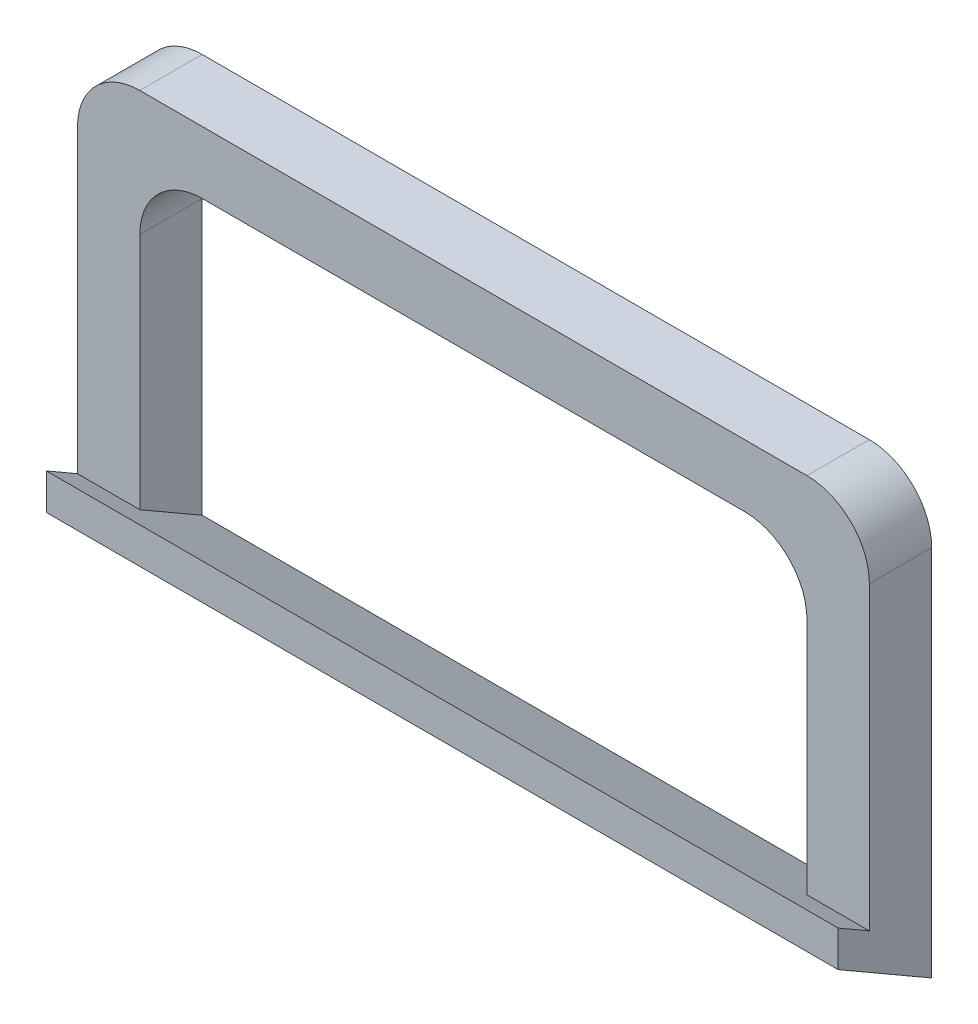
ISO-10303-21;
HEADER;
FILE_DESCRIPTION(('STEP AP214'),'2;1');
FILE_NAME('part.step','',(''),(''),'','','');
FILE_SCHEMA(('AUTOMOTIVE_DESIGN { 1 0 10303 214 1 1 1 1 }'));
ENDSEC;
DATA;
#1=APPLICATION_CONTEXT('core data for automotive mechanical design processes');
#2=APPLICATION_PROTOCOL_DEFINITION('international standard','automotive_design',2000,#1);
#3=PRODUCT_CONTEXT('',#1,'mechanical');
#4=PRODUCT('Part','Part','',(#3));
#5=PRODUCT_RELATED_PRODUCT_CATEGORY('part','',(#4));
#6=PRODUCT_DEFINITION_FORMATION('','',#4);
#7=PRODUCT_DEFINITION_CONTEXT('part definition',#1,'design');
#8=PRODUCT_DEFINITION('design','',#6,#7);
#9=PRODUCT_DEFINITION_SHAPE('','',#8);
#10=(LENGTH_UNIT() NAMED_UNIT(*) SI_UNIT(.MILLI.,.METRE.));
#11=(NAMED_UNIT(*) PLANE_ANGLE_UNIT() SI_UNIT($,.RADIAN.));
#12=(NAMED_UNIT(*) SI_UNIT($,.STERADIAN.) SOLID_ANGLE_UNIT());
#13=UNCERTAINTY_MEASURE_WITH_UNIT(LENGTH_MEASURE(1.E-05),#10,'distance_accuracy_value','');
#14=(GEOMETRIC_REPRESENTATION_CONTEXT(3) GLOBAL_UNCERTAINTY_ASSIGNED_CONTEXT((#13)) GLOBAL_UNIT_ASSIGNED_CONTEXT((#10,
#11,#12)) REPRESENTATION_CONTEXT('',''));
#15=CARTESIAN_POINT('',(0.,0.,0.));
#16=DIRECTION('',(0.,0.,1.));
#17=DIRECTION('',(1.,0.,0.));
#18=AXIS2_PLACEMENT_3D('',#15,#16,#17);
#19=CARTESIAN_POINT('',(-26.9311619996836,-5.2517006802721,10.));
#20=DIRECTION('',(-1.,0.,0.));
#21=DIRECTION('',(0.,0.,1.));
#22=AXIS2_PLACEMENT_3D('',#19,#20,#21);
#23=PLANE('',#22);
#24=DIRECTION('',(0.,1.,0.));
#25=VECTOR('',#24,1.);
#26=CARTESIAN_POINT('',(-26.9311619996836,-5.2517006802721,10.));
#27=LINE('',#26,#25);
#28=CARTESIAN_POINT('',(-26.9311619996836,0.521802011624217,10.));
#29=VERTEX_POINT('',#28);
#30=CARTESIAN_POINT('',(-26.9311619996836,38.7482993197278,10.));
#31=VERTEX_POINT('',#30);
#32=EDGE_CURVE('E212',#29,#31,#27,.T.);
#33=ORIENTED_EDGE('',*,*,#32,.F.);
#34=DIRECTION('',(0.,-0.500000000000004,-0.866025403784436));
#35=VECTOR('',#34,1.);
#36=CARTESIAN_POINT('',(-26.9311619996836,-0.921573661349882,7.49999999999996));
#37=LINE('',#36,#35);
#38=CARTESIAN_POINT('',(-26.9311619996836,-5.2517006802721,0.));
#39=VERTEX_POINT('',#38);
#40=EDGE_CURVE('E207',#29,#39,#37,.T.);
#41=ORIENTED_EDGE('',*,*,#40,.T.);
#42=DIRECTION('',(0.,1.,0.));
#43=VECTOR('',#42,1.);
#44=CARTESIAN_POINT('',(-26.9311619996836,-5.2517006802721,0.));
#45=LINE('',#44,#43);
#46=CARTESIAN_POINT('',(-26.9311619996836,38.7482993197278,0.));
#47=VERTEX_POINT('',#46);
#48=EDGE_CURVE('E211',#39,#47,#45,.T.);
#49=ORIENTED_EDGE('',*,*,#48,.T.);
#50=DIRECTION('',(0.,0.,-1.));
#51=VECTOR('',#50,1.);
#52=CARTESIAN_POINT('',(-26.9311619996836,38.7482993197278,10.));
#53=LINE('',#52,#51);
#54=EDGE_CURVE('E11',#31,#47,#53,.T.);
#55=ORIENTED_EDGE('',*,*,#54,.F.);
#56=EDGE_LOOP('',(#33,#41,#49,#55));
#57=FACE_BOUND('',#56,.T.);
#58=ADVANCED_FACE('F43',(#57),#23,.F.);
#59=CARTESIAN_POINT('',(-16.9311619996836,38.7482993197279,10.));
#60=DIRECTION('',(0.,0.,-1.));
#61=DIRECTION('',(-1.,0.,0.));
#62=AXIS2_PLACEMENT_3D('',#59,#60,#61);
#63=CYLINDRICAL_SURFACE('',#62,10.);
#64=CARTESIAN_POINT('',(-16.9311619996836,38.7482993197279,0.));
#65=DIRECTION('',(0.,0.,-1.));
#66=DIRECTION('',(-1.,0.,0.));
#67=AXIS2_PLACEMENT_3D('',#64,#65,#66);
#68=CIRCLE('',#67,10.);
#69=CARTESIAN_POINT('',(-16.9311619996835,48.7482993197279,0.));
#70=VERTEX_POINT('',#69);
#71=EDGE_CURVE('E245',#47,#70,#68,.T.);
#72=ORIENTED_EDGE('',*,*,#71,.T.);
#73=DIRECTION('',(0.,0.,-1.));
#74=VECTOR('',#73,1.);
#75=CARTESIAN_POINT('',(-16.9311619996835,48.7482993197279,10.));
#76=LINE('',#75,#74);
#77=CARTESIAN_POINT('',(-16.9311619996835,48.7482993197279,10.));
#78=VERTEX_POINT('',#77);
#79=EDGE_CURVE('E51',#78,#70,#76,.T.);
#80=ORIENTED_EDGE('',*,*,#79,.F.);
#81=CARTESIAN_POINT('',(-16.9311619996836,38.7482993197279,10.));
#82=DIRECTION('',(0.,0.,-1.));
#83=DIRECTION('',(-1.,0.,0.));
#84=AXIS2_PLACEMENT_3D('',#81,#82,#83);
#85=CIRCLE('',#84,10.);
#86=EDGE_CURVE('E215',#31,#78,#85,.T.);
#87=ORIENTED_EDGE('',*,*,#86,.F.);
#88=ORIENTED_EDGE('',*,*,#54,.T.);
#89=EDGE_LOOP('',(#72,#80,#87,#88));
#90=FACE_BOUND('',#89,.T.);
#91=ADVANCED_FACE('F335',(#90),#63,.F.);
#92=CARTESIAN_POINT('',(-16.9311619996835,48.7482993197279,10.));
#93=DIRECTION('',(0.,1.,0.));
#94=DIRECTION('',(-1.,0.,0.));
#95=AXIS2_PLACEMENT_3D('',#92,#93,#94);
#96=PLANE('',#95);
#97=DIRECTION('',(1.,0.,0.));
#98=VECTOR('',#97,1.);
#99=CARTESIAN_POINT('',(-16.9311619996835,48.7482993197279,0.));
#100=LINE('',#99,#98);
#101=CARTESIAN_POINT('',(70.0688380003163,48.7482993197278,0.));
#102=VERTEX_POINT('',#101);
#103=EDGE_CURVE('E248',#70,#102,#100,.T.);
#104=ORIENTED_EDGE('',*,*,#103,.T.);
#105=DIRECTION('',(0.,0.,-1.));
#106=VECTOR('',#105,1.);
#107=CARTESIAN_POINT('',(70.0688380003163,48.7482993197278,10.));
#108=LINE('',#107,#106);
#109=CARTESIAN_POINT('',(70.0688380003163,48.7482993197278,10.));
#110=VERTEX_POINT('',#109);
#111=EDGE_CURVE('E284',#110,#102,#108,.T.);
#112=ORIENTED_EDGE('',*,*,#111,.F.);
#113=DIRECTION('',(1.,0.,0.));
#114=VECTOR('',#113,1.);
#115=CARTESIAN_POINT('',(-16.9311619996835,48.7482993197279,10.));
#116=LINE('',#115,#114);
#117=EDGE_CURVE('E219',#78,#110,#116,.T.);
#118=ORIENTED_EDGE('',*,*,#117,.F.);
#119=ORIENTED_EDGE('',*,*,#79,.T.);
#120=EDGE_LOOP('',(#104,#112,#118,#119));
#121=FACE_BOUND('',#120,.T.);
#122=ADVANCED_FACE('F293',(#121),#96,.F.);
#123=CARTESIAN_POINT('',(70.0688380003163,38.7482993197278,10.));
#124=DIRECTION('',(0.,0.,-1.));
#125=DIRECTION('',(-1.,0.,0.));
#126=AXIS2_PLACEMENT_3D('',#123,#124,#125);
#127=CYLINDRICAL_SURFACE('',#126,10.);
#128=CARTESIAN_POINT('',(70.0688380003163,38.7482993197278,0.));
#129=DIRECTION('',(0.,0.,-1.));
#130=DIRECTION('',(-1.,0.,0.));
#131=AXIS2_PLACEMENT_3D('',#128,#129,#130);
#132=CIRCLE('',#131,10.);
#133=CARTESIAN_POINT('',(80.0688380003163,38.7482993197278,0.));
#134=VERTEX_POINT('',#133);
#135=EDGE_CURVE('E251',#102,#134,#132,.T.);
#136=ORIENTED_EDGE('',*,*,#135,.T.);
#137=DIRECTION('',(0.,0.,-1.));
#138=VECTOR('',#137,1.);
#139=CARTESIAN_POINT('',(80.0688380003163,38.7482993197278,10.));
#140=LINE('',#139,#138);
#141=CARTESIAN_POINT('',(80.0688380003163,38.7482993197278,10.));
#142=VERTEX_POINT('',#141);
#143=EDGE_CURVE('E280',#142,#134,#140,.T.);
#144=ORIENTED_EDGE('',*,*,#143,.F.);
#145=CARTESIAN_POINT('',(70.0688380003163,38.7482993197278,10.));
#146=DIRECTION('',(0.,0.,-1.));
#147=DIRECTION('',(-1.,0.,0.));
#148=AXIS2_PLACEMENT_3D('',#145,#146,#147);
#149=CIRCLE('',#148,10.);
#150=EDGE_CURVE('E222',#110,#142,#149,.T.);
#151=ORIENTED_EDGE('',*,*,#150,.F.);
#152=ORIENTED_EDGE('',*,*,#111,.T.);
#153=EDGE_LOOP('',(#136,#144,#151,#152));
#154=FACE_BOUND('',#153,.T.);
#155=ADVANCED_FACE('F304',(#154),#127,.F.);
#156=CARTESIAN_POINT('',(80.0688380003163,38.7482993197278,10.));
#157=DIRECTION('',(1.,0.,0.));
#158=DIRECTION('',(0.,0.,-1.));
#159=AXIS2_PLACEMENT_3D('',#156,#157,#158);
#160=PLANE('',#159);
#161=DIRECTION('',(0.,-1.,0.));
#162=VECTOR('',#161,1.);
#163=CARTESIAN_POINT('',(80.0688380003163,38.7482993197278,0.));
#164=LINE('',#163,#162);
#165=CARTESIAN_POINT('',(80.0688380003163,-5.25170068027218,0.));
#166=VERTEX_POINT('',#165);
#167=EDGE_CURVE('E157',#134,#166,#164,.T.);
#168=ORIENTED_EDGE('',*,*,#167,.T.);
#169=DIRECTION('',(0.,0.500000000000004,0.866025403784436));
#170=VECTOR('',#169,1.);
#171=CARTESIAN_POINT('',(80.0688380003163,10.0784263386503,26.5525588832577));
#172=LINE('',#171,#170);
#173=CARTESIAN_POINT('',(80.0688380003163,0.521802011624217,10.));
#174=VERTEX_POINT('',#173);
#175=EDGE_CURVE('E203',#166,#174,#172,.T.);
#176=ORIENTED_EDGE('',*,*,#175,.T.);
#177=DIRECTION('',(0.,-1.,0.));
#178=VECTOR('',#177,1.);
#179=CARTESIAN_POINT('',(80.0688380003163,38.7482993197278,10.));
#180=LINE('',#179,#178);
#181=EDGE_CURVE('E225',#142,#174,#180,.T.);
#182=ORIENTED_EDGE('',*,*,#181,.F.);
#183=ORIENTED_EDGE('',*,*,#143,.T.);
#184=EDGE_LOOP('',(#168,#176,#182,#183));
#185=FACE_BOUND('',#184,.T.);
#186=ADVANCED_FACE('F308',(#185),#160,.F.);
#187=CARTESIAN_POINT('',(90.0688380003164,48.7482993197278,10.));
#188=DIRECTION('',(-1.,0.,0.));
#189=DIRECTION('',(0.,0.,1.));
#190=AXIS2_PLACEMENT_3D('',#187,#188,#189);
#191=PLANE('',#190);
#192=DIRECTION('',(0.,1.,0.));
#193=VECTOR('',#192,1.);
#194=CARTESIAN_POINT('',(90.0688380003164,48.7482993197278,10.));
#195=LINE('',#194,#193);
#196=CARTESIAN_POINT('',(90.0688380003164,0.521802011624224,10.));
#197=VERTEX_POINT('',#196);
#198=CARTESIAN_POINT('',(90.0688380003164,48.7482993197278,10.));
#199=VERTEX_POINT('',#198);
#200=EDGE_CURVE('E228',#197,#199,#195,.T.);
#201=ORIENTED_EDGE('',*,*,#200,.F.);
#202=DIRECTION('',(0.,-0.500000000000004,-0.866025403784436));
#203=VECTOR('',#202,1.);
#204=CARTESIAN_POINT('',(90.0688380003165,-5.2517006802721,0.));
#205=LINE('',#204,#203);
#206=CARTESIAN_POINT('',(90.0688380003165,3.40855335757238,15.));
#207=VERTEX_POINT('',#206);
#208=EDGE_CURVE('E167',#207,#197,#205,.T.);
#209=ORIENTED_EDGE('',*,*,#208,.F.);
#210=DIRECTION('',(0.,1.,0.));
#211=VECTOR('',#210,1.);
#212=CARTESIAN_POINT('',(90.0688380003165,3.40855335757238,15.));
#213=LINE('',#212,#211);
#214=CARTESIAN_POINT('',(90.0688380003165,-2.36494933432394,15.));
#215=VERTEX_POINT('',#214);
#216=EDGE_CURVE('E173',#215,#207,#213,.T.);
#217=ORIENTED_EDGE('',*,*,#216,.F.);
#218=DIRECTION('',(0.,0.500000000000004,0.866025403784436));
#219=VECTOR('',#218,1.);
#220=CARTESIAN_POINT('',(90.0688380003165,-11.0252033721684,0.));
#221=LINE('',#220,#219);
#222=CARTESIAN_POINT('',(90.0688380003165,-11.0252033721684,0.));
#223=VERTEX_POINT('',#222);
#224=EDGE_CURVE('E162',#223,#215,#221,.T.);
#225=ORIENTED_EDGE('',*,*,#224,.F.);
#226=DIRECTION('',(0.,1.,0.));
#227=VECTOR('',#226,1.);
#228=CARTESIAN_POINT('',(90.0688380003164,48.7482993197278,0.));
#229=LINE('',#228,#227);
#230=CARTESIAN_POINT('',(90.0688380003164,48.7482993197278,0.));
#231=VERTEX_POINT('',#230);
#232=EDGE_CURVE('E144',#223,#231,#229,.T.);
#233=ORIENTED_EDGE('',*,*,#232,.T.);
#234=DIRECTION('',(0.,0.,-1.));
#235=VECTOR('',#234,1.);
#236=CARTESIAN_POINT('',(90.0688380003164,48.7482993197278,10.));
#237=LINE('',#236,#235);
#238=EDGE_CURVE('E277',#199,#231,#237,.T.);
#239=ORIENTED_EDGE('',*,*,#238,.F.);
#240=EDGE_LOOP('',(#201,#209,#217,#225,#233,#239));
#241=FACE_BOUND('',#240,.T.);
#242=ADVANCED_FACE('F170',(#241),#191,.F.);
#243=CARTESIAN_POINT('',(80.0688380003163,48.7482993197278,10.));
#244=DIRECTION('',(0.,0.,-1.));
#245=DIRECTION('',(-1.,0.,0.));
#246=AXIS2_PLACEMENT_3D('',#243,#244,#245);
#247=CYLINDRICAL_SURFACE('',#246,10.0000000000001);
#248=CARTESIAN_POINT('',(80.0688380003163,48.7482993197278,0.));
#249=DIRECTION('',(0.,0.,1.));
#250=DIRECTION('',(-1.,0.,0.));
#251=AXIS2_PLACEMENT_3D('',#248,#249,#250);
#252=CIRCLE('',#251,10.0000000000001);
#253=CARTESIAN_POINT('',(80.0688380003163,58.7482993197279,0.));
#254=VERTEX_POINT('',#253);
#255=EDGE_CURVE('E151',#231,#254,#252,.T.);
#256=ORIENTED_EDGE('',*,*,#255,.T.);
#257=DIRECTION('',(0.,0.,-1.));
#258=VECTOR('',#257,1.);
#259=CARTESIAN_POINT('',(80.0688380003163,58.7482993197279,10.));
#260=LINE('',#259,#258);
#261=CARTESIAN_POINT('',(80.0688380003163,58.7482993197279,10.));
#262=VERTEX_POINT('',#261);
#263=EDGE_CURVE('E273',#262,#254,#260,.T.);
#264=ORIENTED_EDGE('',*,*,#263,.F.);
#265=CARTESIAN_POINT('',(80.0688380003163,48.7482993197278,10.));
#266=DIRECTION('',(0.,0.,1.));
#267=DIRECTION('',(-1.,0.,0.));
#268=AXIS2_PLACEMENT_3D('',#265,#266,#267);
#269=CIRCLE('',#268,10.0000000000001);
#270=EDGE_CURVE('E231',#199,#262,#269,.T.);
#271=ORIENTED_EDGE('',*,*,#270,.F.);
#272=ORIENTED_EDGE('',*,*,#238,.T.);
#273=EDGE_LOOP('',(#256,#264,#271,#272));
#274=FACE_BOUND('',#273,.T.);
#275=ADVANCED_FACE('F320',(#274),#247,.T.);
#276=CARTESIAN_POINT('',(-26.9311619996835,58.7482993197279,10.));
#277=DIRECTION('',(0.,-1.,0.));
#278=DIRECTION('',(1.,0.,0.));
#279=AXIS2_PLACEMENT_3D('',#276,#277,#278);
#280=PLANE('',#279);
#281=DIRECTION('',(-1.,0.,0.));
#282=VECTOR('',#281,1.);
#283=CARTESIAN_POINT('',(-26.9311619996835,58.7482993197279,0.));
#284=LINE('',#283,#282);
#285=CARTESIAN_POINT('',(-26.9311619996835,58.7482993197279,0.));
#286=VERTEX_POINT('',#285);
#287=EDGE_CURVE('E258',#254,#286,#284,.T.);
#288=ORIENTED_EDGE('',*,*,#287,.T.);
#289=DIRECTION('',(0.,0.,-1.));
#290=VECTOR('',#289,1.);
#291=CARTESIAN_POINT('',(-26.9311619996835,58.7482993197279,10.));
#292=LINE('',#291,#290);
#293=CARTESIAN_POINT('',(-26.9311619996835,58.7482993197279,10.));
#294=VERTEX_POINT('',#293);
#295=EDGE_CURVE('E269',#294,#286,#292,.T.);
#296=ORIENTED_EDGE('',*,*,#295,.F.);
#297=DIRECTION('',(-1.,0.,0.));
#298=VECTOR('',#297,1.);
#299=CARTESIAN_POINT('',(-26.9311619996835,58.7482993197279,10.));
#300=LINE('',#299,#298);
#301=EDGE_CURVE('E234',#262,#294,#300,.T.);
#302=ORIENTED_EDGE('',*,*,#301,.F.);
#303=ORIENTED_EDGE('',*,*,#263,.T.);
#304=EDGE_LOOP('',(#288,#296,#302,#303));
#305=FACE_BOUND('',#304,.T.);
#306=ADVANCED_FACE('F322',(#305),#280,.F.);
#307=CARTESIAN_POINT('',(-26.9311619996836,48.7482993197279,10.));
#308=DIRECTION('',(0.,0.,-1.));
#309=DIRECTION('',(-1.,0.,0.));
#310=AXIS2_PLACEMENT_3D('',#307,#308,#309);
#311=CYLINDRICAL_SURFACE('',#310,10.);
#312=CARTESIAN_POINT('',(-26.9311619996836,48.7482993197279,0.));
#313=DIRECTION('',(0.,0.,1.));
#314=DIRECTION('',(1.,0.,0.));
#315=AXIS2_PLACEMENT_3D('',#312,#313,#314);
#316=CIRCLE('',#315,10.);
#317=CARTESIAN_POINT('',(-36.9311619996836,48.7482993197278,0.));
#318=VERTEX_POINT('',#317);
#319=EDGE_CURVE('E261',#286,#318,#316,.T.);
#320=ORIENTED_EDGE('',*,*,#319,.T.);
#321=DIRECTION('',(0.,0.,-1.));
#322=VECTOR('',#321,1.);
#323=CARTESIAN_POINT('',(-36.9311619996836,48.7482993197278,10.));
#324=LINE('',#323,#322);
#325=CARTESIAN_POINT('',(-36.9311619996836,48.7482993197278,10.));
#326=VERTEX_POINT('',#325);
#327=EDGE_CURVE('E242',#326,#318,#324,.T.);
#328=ORIENTED_EDGE('',*,*,#327,.F.);
#329=CARTESIAN_POINT('',(-26.9311619996836,48.7482993197279,10.));
#330=DIRECTION('',(0.,0.,1.));
#331=DIRECTION('',(1.,0.,0.));
#332=AXIS2_PLACEMENT_3D('',#329,#330,#331);
#333=CIRCLE('',#332,10.);
#334=EDGE_CURVE('E237',#294,#326,#333,.T.);
#335=ORIENTED_EDGE('',*,*,#334,.F.);
#336=ORIENTED_EDGE('',*,*,#295,.T.);
#337=EDGE_LOOP('',(#320,#328,#335,#336));
#338=FACE_BOUND('',#337,.T.);
#339=ADVANCED_FACE('F327',(#338),#311,.T.);
#340=CARTESIAN_POINT('',(-36.9311619996836,-5.2517006802721,10.));
#341=DIRECTION('',(1.,0.,0.));
#342=DIRECTION('',(0.,0.,-1.));
#343=AXIS2_PLACEMENT_3D('',#340,#341,#342);
#344=PLANE('',#343);
#345=DIRECTION('',(0.,-1.,0.));
#346=VECTOR('',#345,1.);
#347=CARTESIAN_POINT('',(-36.9311619996836,-5.2517006802721,0.));
#348=LINE('',#347,#346);
#349=CARTESIAN_POINT('',(-36.9311619996836,-11.0252033721684,0.));
#350=VERTEX_POINT('',#349);
#351=EDGE_CURVE('E216',#318,#350,#348,.T.);
#352=ORIENTED_EDGE('',*,*,#351,.T.);
#353=DIRECTION('',(0.,0.500000000000004,0.866025403784436));
#354=VECTOR('',#353,1.);
#355=CARTESIAN_POINT('',(-36.9311619996836,-11.0252033721684,0.));
#356=LINE('',#355,#354);
#357=CARTESIAN_POINT('',(-36.9311619996836,-2.36494933432394,15.));
#358=VERTEX_POINT('',#357);
#359=EDGE_CURVE('E164',#350,#358,#356,.T.);
#360=ORIENTED_EDGE('',*,*,#359,.T.);
#361=DIRECTION('',(0.,1.,0.));
#362=VECTOR('',#361,1.);
#363=CARTESIAN_POINT('',(-36.9311619996836,3.40855335757238,15.));
#364=LINE('',#363,#362);
#365=CARTESIAN_POINT('',(-36.9311619996836,3.40855335757238,15.));
#366=VERTEX_POINT('',#365);
#367=EDGE_CURVE('E181',#358,#366,#364,.T.);
#368=ORIENTED_EDGE('',*,*,#367,.T.);
#369=DIRECTION('',(0.,-0.500000000000004,-0.866025403784436));
#370=VECTOR('',#369,1.);
#371=CARTESIAN_POINT('',(-36.9311619996836,-5.2517006802721,0.));
#372=LINE('',#371,#370);
#373=CARTESIAN_POINT('',(-36.9311619996836,0.521802011624223,10.));
#374=VERTEX_POINT('',#373);
#375=EDGE_CURVE('E175',#366,#374,#372,.T.);
#376=ORIENTED_EDGE('',*,*,#375,.T.);
#377=DIRECTION('',(0.,-1.,0.));
#378=VECTOR('',#377,1.);
#379=CARTESIAN_POINT('',(-36.9311619996836,-5.2517006802721,10.));
#380=LINE('',#379,#378);
#381=EDGE_CURVE('E58',#326,#374,#380,.T.);
#382=ORIENTED_EDGE('',*,*,#381,.F.);
#383=ORIENTED_EDGE('',*,*,#327,.T.);
#384=EDGE_LOOP('',(#352,#360,#368,#376,#382,#383));
#385=FACE_BOUND('',#384,.T.);
#386=ADVANCED_FACE('F329',(#385),#344,.F.);
#387=CARTESIAN_POINT('',(-16.9311619996836,38.7482993197279,10.));
#388=DIRECTION('',(0.,0.,-1.));
#389=DIRECTION('',(-1.,0.,0.));
#390=AXIS2_PLACEMENT_3D('',#387,#388,#389);
#391=PLANE('',#390);
#392=ORIENTED_EDGE('',*,*,#381,.T.);
#393=DIRECTION('',(1.,0.,0.));
#394=VECTOR('',#393,1.);
#395=CARTESIAN_POINT('',(-16.9311619996836,0.521802011624217,10.));
#396=LINE('',#395,#394);
#397=EDGE_CURVE('E204',#374,#29,#396,.T.);
#398=ORIENTED_EDGE('',*,*,#397,.T.);
#399=ORIENTED_EDGE('',*,*,#32,.T.);
#400=ORIENTED_EDGE('',*,*,#86,.T.);
#401=ORIENTED_EDGE('',*,*,#117,.T.);
#402=ORIENTED_EDGE('',*,*,#150,.T.);
#403=ORIENTED_EDGE('',*,*,#181,.T.);
#404=EDGE_CURVE('E65',#174,#197,#396,.T.);
#405=ORIENTED_EDGE('',*,*,#404,.T.);
#406=ORIENTED_EDGE('',*,*,#200,.T.);
#407=ORIENTED_EDGE('',*,*,#270,.T.);
#408=ORIENTED_EDGE('',*,*,#301,.T.);
#409=ORIENTED_EDGE('',*,*,#334,.T.);
#410=EDGE_LOOP('',(#392,#398,#399,#400,#401,#402,#403,#405,#406,#407,#408,#409));
#411=FACE_BOUND('',#410,.T.);
#412=ADVANCED_FACE('F310',(#411),#391,.F.);
#413=CARTESIAN_POINT('',(-16.9311619996836,38.7482993197279,0.));
#414=DIRECTION('',(0.,0.,-1.));
#415=DIRECTION('',(-1.,0.,0.));
#416=AXIS2_PLACEMENT_3D('',#413,#414,#415);
#417=PLANE('',#416);
#418=ORIENTED_EDGE('',*,*,#48,.F.);
#419=DIRECTION('',(-1.,0.,0.));
#420=VECTOR('',#419,1.);
#421=CARTESIAN_POINT('',(90.0688380003165,-5.2517006802721,0.));
#422=LINE('',#421,#420);
#423=EDGE_CURVE('E192',#166,#39,#422,.T.);
#424=ORIENTED_EDGE('',*,*,#423,.F.);
#425=ORIENTED_EDGE('',*,*,#167,.F.);
#426=ORIENTED_EDGE('',*,*,#135,.F.);
#427=ORIENTED_EDGE('',*,*,#103,.F.);
#428=ORIENTED_EDGE('',*,*,#71,.F.);
#429=EDGE_LOOP('',(#418,#424,#425,#426,#427,#428));
#430=FACE_BOUND('',#429,.T.);
#431=DIRECTION('',(-1.,0.,0.));
#432=VECTOR('',#431,1.);
#433=CARTESIAN_POINT('',(90.0688380003165,-11.0252033721684,0.));
#434=LINE('',#433,#432);
#435=EDGE_CURVE('E148',#223,#350,#434,.T.);
#436=ORIENTED_EDGE('',*,*,#435,.T.);
#437=ORIENTED_EDGE('',*,*,#351,.F.);
#438=ORIENTED_EDGE('',*,*,#319,.F.);
#439=ORIENTED_EDGE('',*,*,#287,.F.);
#440=ORIENTED_EDGE('',*,*,#255,.F.);
#441=ORIENTED_EDGE('',*,*,#232,.F.);
#442=EDGE_LOOP('',(#436,#437,#438,#439,#440,#441));
#443=FACE_BOUND('',#442,.T.);
#444=ADVANCED_FACE('F146',(#430,#443),#417,.T.);
#445=CARTESIAN_POINT('',(90.0688380003165,-5.2517006802721,0.));
#446=DIRECTION('',(0.,0.866025403784436,-0.500000000000004));
#447=DIRECTION('',(0.,0.500000000000004,0.866025403784436));
#448=AXIS2_PLACEMENT_3D('',#445,#446,#447);
#449=PLANE('',#448);
#450=ORIENTED_EDGE('',*,*,#40,.F.);
#451=ORIENTED_EDGE('',*,*,#397,.F.);
#452=ORIENTED_EDGE('',*,*,#375,.F.);
#453=DIRECTION('',(-1.,0.,0.));
#454=VECTOR('',#453,1.);
#455=CARTESIAN_POINT('',(90.0688380003165,3.40855335757238,15.));
#456=LINE('',#455,#454);
#457=EDGE_CURVE('E196',#207,#366,#456,.T.);
#458=ORIENTED_EDGE('',*,*,#457,.F.);
#459=ORIENTED_EDGE('',*,*,#208,.T.);
#460=ORIENTED_EDGE('',*,*,#404,.F.);
#461=ORIENTED_EDGE('',*,*,#175,.F.);
#462=ORIENTED_EDGE('',*,*,#423,.T.);
#463=EDGE_LOOP('',(#450,#451,#452,#458,#459,#460,#461,#462));
#464=FACE_BOUND('',#463,.T.);
#465=ADVANCED_FACE('F313',(#464),#449,.T.);
#466=CARTESIAN_POINT('',(90.0688380003165,3.40855335757238,15.));
#467=DIRECTION('',(0.,0.,1.));
#468=DIRECTION('',(1.,0.,0.));
#469=AXIS2_PLACEMENT_3D('',#466,#467,#468);
#470=PLANE('',#469);
#471=ORIENTED_EDGE('',*,*,#367,.F.);
#472=DIRECTION('',(-1.,0.,0.));
#473=VECTOR('',#472,1.);
#474=CARTESIAN_POINT('',(90.0688380003165,-2.36494933432394,15.));
#475=LINE('',#474,#473);
#476=EDGE_CURVE('E166',#215,#358,#475,.T.);
#477=ORIENTED_EDGE('',*,*,#476,.F.);
#478=ORIENTED_EDGE('',*,*,#216,.T.);
#479=ORIENTED_EDGE('',*,*,#457,.T.);
#480=EDGE_LOOP('',(#471,#477,#478,#479));
#481=FACE_BOUND('',#480,.T.);
#482=ADVANCED_FACE('F363',(#481),#470,.T.);
#483=CARTESIAN_POINT('',(90.0688380003165,-11.0252033721684,0.));
#484=DIRECTION('',(0.,-0.866025403784436,0.500000000000004));
#485=DIRECTION('',(0.,-0.500000000000004,-0.866025403784436));
#486=AXIS2_PLACEMENT_3D('',#483,#484,#485);
#487=PLANE('',#486);
#488=ORIENTED_EDGE('',*,*,#476,.T.);
#489=ORIENTED_EDGE('',*,*,#359,.F.);
#490=ORIENTED_EDGE('',*,*,#435,.F.);
#491=ORIENTED_EDGE('',*,*,#224,.T.);
#492=EDGE_LOOP('',(#488,#489,#490,#491));
#493=FACE_BOUND('',#492,.T.);
#494=ADVANCED_FACE('F161',(#493),#487,.T.);
#495=CLOSED_SHELL('',(#58,#91,#122,#155,#186,#242,#275,#306,#339,#386,#412,#444,#465,#482,#494));
#496=MANIFOLD_SOLID_BREP('B2',#495);
#497=ADVANCED_BREP_SHAPE_REPRESENTATION('',(#18,#496),#14);
#498=SHAPE_DEFINITION_REPRESENTATION(#9,#497);
ENDSEC;
END-ISO-10303-21;
